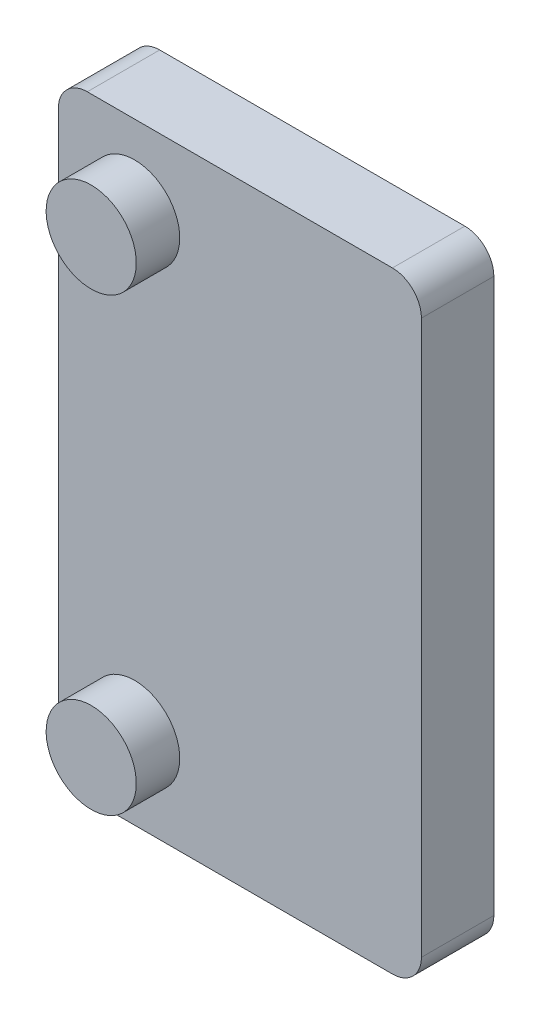
ISO-10303-21;
HEADER;
FILE_DESCRIPTION(('STEP AP214'),'2;1');
FILE_NAME('part.step','',(''),(''),'','','');
FILE_SCHEMA(('AUTOMOTIVE_DESIGN { 1 0 10303 214 1 1 1 1 }'));
ENDSEC;
DATA;
#1=APPLICATION_CONTEXT('core data for automotive mechanical design processes');
#2=APPLICATION_PROTOCOL_DEFINITION('international standard','automotive_design',2000,#1);
#3=PRODUCT_CONTEXT('',#1,'mechanical');
#4=PRODUCT('Part','Part','',(#3));
#5=PRODUCT_RELATED_PRODUCT_CATEGORY('part','',(#4));
#6=PRODUCT_DEFINITION_FORMATION('','',#4);
#7=PRODUCT_DEFINITION_CONTEXT('part definition',#1,'design');
#8=PRODUCT_DEFINITION('design','',#6,#7);
#9=PRODUCT_DEFINITION_SHAPE('','',#8);
#10=(LENGTH_UNIT() NAMED_UNIT(*) SI_UNIT(.MILLI.,.METRE.));
#11=(NAMED_UNIT(*) PLANE_ANGLE_UNIT() SI_UNIT($,.RADIAN.));
#12=(NAMED_UNIT(*) SI_UNIT($,.STERADIAN.) SOLID_ANGLE_UNIT());
#13=UNCERTAINTY_MEASURE_WITH_UNIT(LENGTH_MEASURE(1.E-05),#10,'distance_accuracy_value','');
#14=(GEOMETRIC_REPRESENTATION_CONTEXT(3) GLOBAL_UNCERTAINTY_ASSIGNED_CONTEXT((#13)) GLOBAL_UNIT_ASSIGNED_CONTEXT((#10,
#11,#12)) REPRESENTATION_CONTEXT('',''));
#15=CARTESIAN_POINT('',(0.,0.,0.));
#16=DIRECTION('',(0.,0.,1.));
#17=DIRECTION('',(1.,0.,0.));
#18=AXIS2_PLACEMENT_3D('',#15,#16,#17);
#19=CARTESIAN_POINT('',(6.874,10.5537,0.));
#20=DIRECTION('',(0.,0.,-1.));
#21=DIRECTION('',(-1.,0.,0.));
#22=AXIS2_PLACEMENT_3D('',#19,#20,#21);
#23=PLANE('',#22);
#24=CARTESIAN_POINT('',(10.5332083793333,20.1074,0.));
#25=DIRECTION('',(0.,0.,1.));
#26=DIRECTION('',(0.707106781186548,0.707106781186547,0.));
#27=AXIS2_PLACEMENT_3D('',#24,#25,#26);
#28=CIRCLE('',#27,1.);
#29=CARTESIAN_POINT('',(11.5332083793333,20.1074,0.));
#30=VERTEX_POINT('',#29);
#31=CARTESIAN_POINT('',(10.5332083793333,21.1074,0.));
#32=VERTEX_POINT('',#31);
#33=EDGE_CURVE('P0_E190',#30,#32,#28,.T.);
#34=ORIENTED_EDGE('',*,*,#33,.F.);
#35=DIRECTION('',(0.,-1.,0.));
#36=VECTOR('',#35,1.);
#37=CARTESIAN_POINT('',(11.5332083793333,0.,0.));
#38=LINE('',#37,#36);
#39=CARTESIAN_POINT('',(11.5332083793333,1.,0.));
#40=VERTEX_POINT('',#39);
#41=EDGE_CURVE('P0_E11',#30,#40,#38,.T.);
#42=ORIENTED_EDGE('',*,*,#41,.T.);
#43=CARTESIAN_POINT('',(10.5332083793333,1.,0.));
#44=DIRECTION('',(0.,0.,1.));
#45=DIRECTION('',(0.707106781186547,-0.707106781186548,0.));
#46=AXIS2_PLACEMENT_3D('',#43,#44,#45);
#47=CIRCLE('',#46,1.);
#48=CARTESIAN_POINT('',(10.5332083793333,0.,0.));
#49=VERTEX_POINT('',#48);
#50=EDGE_CURVE('P0_E93',#49,#40,#47,.T.);
#51=ORIENTED_EDGE('',*,*,#50,.F.);
#52=DIRECTION('',(-1.,0.,0.));
#53=VECTOR('',#52,1.);
#54=CARTESIAN_POINT('',(-1.,0.,0.));
#55=LINE('',#54,#53);
#56=CARTESIAN_POINT('',(0.,0.,0.));
#57=VERTEX_POINT('',#56);
#58=EDGE_CURVE('P0_E79',#49,#57,#55,.T.);
#59=ORIENTED_EDGE('',*,*,#58,.T.);
#60=CARTESIAN_POINT('',(0.,1.,0.));
#61=DIRECTION('',(0.,0.,1.));
#62=DIRECTION('',(-0.707106781186546,-0.707106781186549,0.));
#63=AXIS2_PLACEMENT_3D('',#60,#61,#62);
#64=CIRCLE('',#63,1.);
#65=CARTESIAN_POINT('',(-1.,1.,0.));
#66=VERTEX_POINT('',#65);
#67=EDGE_CURVE('P0_E50',#66,#57,#64,.T.);
#68=ORIENTED_EDGE('',*,*,#67,.F.);
#69=DIRECTION('',(0.,1.,0.));
#70=VECTOR('',#69,1.);
#71=CARTESIAN_POINT('',(-1.,21.1074,0.));
#72=LINE('',#71,#70);
#73=CARTESIAN_POINT('',(-1.,20.1074,0.));
#74=VERTEX_POINT('',#73);
#75=EDGE_CURVE('P0_E26',#66,#74,#72,.T.);
#76=ORIENTED_EDGE('',*,*,#75,.T.);
#77=CARTESIAN_POINT('',(0.,20.1074,0.));
#78=DIRECTION('',(0.,0.,1.));
#79=DIRECTION('',(-0.707106781186546,0.707106781186549,0.));
#80=AXIS2_PLACEMENT_3D('',#77,#78,#79);
#81=CIRCLE('',#80,1.);
#82=CARTESIAN_POINT('',(0.,21.1074,0.));
#83=VERTEX_POINT('',#82);
#84=EDGE_CURVE('P0_E113',#83,#74,#81,.T.);
#85=ORIENTED_EDGE('',*,*,#84,.F.);
#86=DIRECTION('',(1.,0.,0.));
#87=VECTOR('',#86,1.);
#88=CARTESIAN_POINT('',(11.5332083793333,21.1074,0.));
#89=LINE('',#88,#87);
#90=EDGE_CURVE('P0_E152',#83,#32,#89,.T.);
#91=ORIENTED_EDGE('',*,*,#90,.T.);
#92=EDGE_LOOP('',(#34,#42,#51,#59,#68,#76,#85,#91));
#93=FACE_BOUND('',#92,.T.);
#94=ADVANCED_FACE('P0_F17',(#93),#23,.T.);
#95=CARTESIAN_POINT('',(11.5332083793333,21.1074,2.5));
#96=DIRECTION('',(1.,0.,0.));
#97=DIRECTION('',(0.,-1.,0.));
#98=AXIS2_PLACEMENT_3D('',#95,#96,#97);
#99=PLANE('',#98);
#100=DIRECTION('',(0.,0.,-1.));
#101=VECTOR('',#100,1.);
#102=CARTESIAN_POINT('',(11.5332083793333,20.1074,2.5));
#103=LINE('',#102,#101);
#104=CARTESIAN_POINT('',(11.5332083793333,20.1074,2.5));
#105=VERTEX_POINT('',#104);
#106=EDGE_CURVE('P0_E119',#105,#30,#103,.T.);
#107=ORIENTED_EDGE('',*,*,#106,.F.);
#108=DIRECTION('',(0.,1.,0.));
#109=VECTOR('',#108,1.);
#110=CARTESIAN_POINT('',(11.5332083793333,0.,2.5));
#111=LINE('',#110,#109);
#112=CARTESIAN_POINT('',(11.5332083793333,1.,2.5));
#113=VERTEX_POINT('',#112);
#114=EDGE_CURVE('P0_E148',#113,#105,#111,.T.);
#115=ORIENTED_EDGE('',*,*,#114,.F.);
#116=DIRECTION('',(0.,0.,1.));
#117=VECTOR('',#116,1.);
#118=CARTESIAN_POINT('',(11.5332083793333,1.,2.5));
#119=LINE('',#118,#117);
#120=EDGE_CURVE('P0_E98',#40,#113,#119,.T.);
#121=ORIENTED_EDGE('',*,*,#120,.F.);
#122=ORIENTED_EDGE('',*,*,#41,.F.);
#123=EDGE_LOOP('',(#107,#115,#121,#122));
#124=FACE_BOUND('',#123,.T.);
#125=ADVANCED_FACE('P0_F217',(#124),#99,.T.);
#126=CARTESIAN_POINT('',(-1.,0.,2.5));
#127=DIRECTION('',(-1.,0.,0.));
#128=DIRECTION('',(0.,0.,1.));
#129=AXIS2_PLACEMENT_3D('',#126,#127,#128);
#130=PLANE('',#129);
#131=DIRECTION('',(0.,0.,1.));
#132=VECTOR('',#131,1.);
#133=CARTESIAN_POINT('',(-1.,20.1074,2.5));
#134=LINE('',#133,#132);
#135=CARTESIAN_POINT('',(-1.,20.1074,2.5));
#136=VERTEX_POINT('',#135);
#137=EDGE_CURVE('P0_E104',#74,#136,#134,.T.);
#138=ORIENTED_EDGE('',*,*,#137,.F.);
#139=ORIENTED_EDGE('',*,*,#75,.F.);
#140=DIRECTION('',(0.,0.,-1.));
#141=VECTOR('',#140,1.);
#142=CARTESIAN_POINT('',(-1.,1.,2.5));
#143=LINE('',#142,#141);
#144=CARTESIAN_POINT('',(-1.,1.,2.5));
#145=VERTEX_POINT('',#144);
#146=EDGE_CURVE('P0_E20',#145,#66,#143,.T.);
#147=ORIENTED_EDGE('',*,*,#146,.F.);
#148=DIRECTION('',(0.,-1.,0.));
#149=VECTOR('',#148,1.);
#150=CARTESIAN_POINT('',(-1.,21.1074,2.5));
#151=LINE('',#150,#149);
#152=EDGE_CURVE('P0_E130',#136,#145,#151,.T.);
#153=ORIENTED_EDGE('',*,*,#152,.F.);
#154=EDGE_LOOP('',(#138,#139,#147,#153));
#155=FACE_BOUND('',#154,.T.);
#156=ADVANCED_FACE('P0_F172',(#155),#130,.T.);
#157=CARTESIAN_POINT('',(0.,1.,2.5));
#158=DIRECTION('',(0.,0.,-1.));
#159=DIRECTION('',(-0.707106781186546,-0.707106781186549,0.));
#160=AXIS2_PLACEMENT_3D('',#157,#158,#159);
#161=CYLINDRICAL_SURFACE('',#160,1.);
#162=ORIENTED_EDGE('',*,*,#67,.T.);
#163=DIRECTION('',(0.,0.,1.));
#164=VECTOR('',#163,1.);
#165=CARTESIAN_POINT('',(0.,0.,2.5));
#166=LINE('',#165,#164);
#167=CARTESIAN_POINT('',(0.,0.,2.5));
#168=VERTEX_POINT('',#167);
#169=EDGE_CURVE('P0_E85',#57,#168,#166,.T.);
#170=ORIENTED_EDGE('',*,*,#169,.T.);
#171=CARTESIAN_POINT('',(0.,1.,2.5));
#172=DIRECTION('',(0.,0.,-1.));
#173=DIRECTION('',(-0.707106781186546,-0.707106781186549,0.));
#174=AXIS2_PLACEMENT_3D('',#171,#172,#173);
#175=CIRCLE('',#174,1.);
#176=EDGE_CURVE('P0_E135',#168,#145,#175,.T.);
#177=ORIENTED_EDGE('',*,*,#176,.T.);
#178=ORIENTED_EDGE('',*,*,#146,.T.);
#179=EDGE_LOOP('',(#162,#170,#177,#178));
#180=FACE_BOUND('',#179,.T.);
#181=ADVANCED_FACE('P0_F168',(#180),#161,.T.);
#182=CARTESIAN_POINT('',(11.5332083793333,0.,2.5));
#183=DIRECTION('',(0.,-1.,0.));
#184=DIRECTION('',(0.,0.,-1.));
#185=AXIS2_PLACEMENT_3D('',#182,#183,#184);
#186=PLANE('',#185);
#187=DIRECTION('',(0.,0.,-1.));
#188=VECTOR('',#187,1.);
#189=CARTESIAN_POINT('',(10.5332083793333,0.,2.5));
#190=LINE('',#189,#188);
#191=CARTESIAN_POINT('',(10.5332083793333,0.,2.5));
#192=VERTEX_POINT('',#191);
#193=EDGE_CURVE('P0_E83',#192,#49,#190,.T.);
#194=ORIENTED_EDGE('',*,*,#193,.F.);
#195=DIRECTION('',(1.,0.,0.));
#196=VECTOR('',#195,1.);
#197=CARTESIAN_POINT('',(-1.,0.,2.5));
#198=LINE('',#197,#196);
#199=EDGE_CURVE('P0_E139',#168,#192,#198,.T.);
#200=ORIENTED_EDGE('',*,*,#199,.F.);
#201=ORIENTED_EDGE('',*,*,#169,.F.);
#202=ORIENTED_EDGE('',*,*,#58,.F.);
#203=EDGE_LOOP('',(#194,#200,#201,#202));
#204=FACE_BOUND('',#203,.T.);
#205=ADVANCED_FACE('P0_F81',(#204),#186,.T.);
#206=CARTESIAN_POINT('',(10.5332083793333,1.,2.5));
#207=DIRECTION('',(0.,0.,-1.));
#208=DIRECTION('',(0.707106781186547,-0.707106781186548,0.));
#209=AXIS2_PLACEMENT_3D('',#206,#207,#208);
#210=CYLINDRICAL_SURFACE('',#209,1.);
#211=ORIENTED_EDGE('',*,*,#50,.T.);
#212=ORIENTED_EDGE('',*,*,#120,.T.);
#213=CARTESIAN_POINT('',(10.5332083793333,1.,2.5));
#214=DIRECTION('',(0.,0.,-1.));
#215=DIRECTION('',(0.707106781186547,-0.707106781186548,0.));
#216=AXIS2_PLACEMENT_3D('',#213,#214,#215);
#217=CIRCLE('',#216,1.);
#218=EDGE_CURVE('P0_E95',#113,#192,#217,.T.);
#219=ORIENTED_EDGE('',*,*,#218,.T.);
#220=ORIENTED_EDGE('',*,*,#193,.T.);
#221=EDGE_LOOP('',(#211,#212,#219,#220));
#222=FACE_BOUND('',#221,.T.);
#223=ADVANCED_FACE('P0_F92',(#222),#210,.T.);
#224=CARTESIAN_POINT('',(0.,20.1074,2.5));
#225=DIRECTION('',(0.,0.,-1.));
#226=DIRECTION('',(-0.707106781186546,0.707106781186549,0.));
#227=AXIS2_PLACEMENT_3D('',#224,#225,#226);
#228=CYLINDRICAL_SURFACE('',#227,1.);
#229=ORIENTED_EDGE('',*,*,#84,.T.);
#230=ORIENTED_EDGE('',*,*,#137,.T.);
#231=CARTESIAN_POINT('',(0.,20.1074,2.5));
#232=DIRECTION('',(0.,0.,-1.));
#233=DIRECTION('',(-0.707106781186546,0.707106781186549,0.));
#234=AXIS2_PLACEMENT_3D('',#231,#232,#233);
#235=CIRCLE('',#234,1.);
#236=CARTESIAN_POINT('',(0.,21.1074,2.5));
#237=VERTEX_POINT('',#236);
#238=EDGE_CURVE('P0_E127',#136,#237,#235,.T.);
#239=ORIENTED_EDGE('',*,*,#238,.T.);
#240=DIRECTION('',(0.,0.,-1.));
#241=VECTOR('',#240,1.);
#242=CARTESIAN_POINT('',(0.,21.1074,2.5));
#243=LINE('',#242,#241);
#244=EDGE_CURVE('P0_E143',#237,#83,#243,.T.);
#245=ORIENTED_EDGE('',*,*,#244,.T.);
#246=EDGE_LOOP('',(#229,#230,#239,#245));
#247=FACE_BOUND('',#246,.T.);
#248=ADVANCED_FACE('P0_F175',(#247),#228,.T.);
#249=CARTESIAN_POINT('',(-1.,21.1074,2.5));
#250=DIRECTION('',(0.,1.,0.));
#251=DIRECTION('',(1.,0.,0.));
#252=AXIS2_PLACEMENT_3D('',#249,#250,#251);
#253=PLANE('',#252);
#254=DIRECTION('',(0.,0.,1.));
#255=VECTOR('',#254,1.);
#256=CARTESIAN_POINT('',(10.5332083793333,21.1074,2.5));
#257=LINE('',#256,#255);
#258=CARTESIAN_POINT('',(10.5332083793333,21.1074,2.5));
#259=VERTEX_POINT('',#258);
#260=EDGE_CURVE('P0_E187',#32,#259,#257,.T.);
#261=ORIENTED_EDGE('',*,*,#260,.F.);
#262=ORIENTED_EDGE('',*,*,#90,.F.);
#263=ORIENTED_EDGE('',*,*,#244,.F.);
#264=DIRECTION('',(-1.,0.,0.));
#265=VECTOR('',#264,1.);
#266=CARTESIAN_POINT('',(11.5332083793333,21.1074,2.5));
#267=LINE('',#266,#265);
#268=EDGE_CURVE('P0_E123',#259,#237,#267,.T.);
#269=ORIENTED_EDGE('',*,*,#268,.F.);
#270=EDGE_LOOP('',(#261,#262,#263,#269));
#271=FACE_BOUND('',#270,.T.);
#272=ADVANCED_FACE('P0_F184',(#271),#253,.T.);
#273=CARTESIAN_POINT('',(6.874,10.5537,2.5));
#274=DIRECTION('',(0.,0.,-1.));
#275=DIRECTION('',(-1.,0.,0.));
#276=AXIS2_PLACEMENT_3D('',#273,#274,#275);
#277=PLANE('',#276);
#278=CARTESIAN_POINT('',(10.5332083793333,20.1074,2.5));
#279=DIRECTION('',(0.,0.,-1.));
#280=DIRECTION('',(0.707106781186548,0.707106781186547,0.));
#281=AXIS2_PLACEMENT_3D('',#278,#279,#280);
#282=CIRCLE('',#281,1.);
#283=EDGE_CURVE('P0_E116',#259,#105,#282,.T.);
#284=ORIENTED_EDGE('',*,*,#283,.F.);
#285=ORIENTED_EDGE('',*,*,#268,.T.);
#286=ORIENTED_EDGE('',*,*,#238,.F.);
#287=ORIENTED_EDGE('',*,*,#152,.T.);
#288=ORIENTED_EDGE('',*,*,#176,.F.);
#289=ORIENTED_EDGE('',*,*,#199,.T.);
#290=ORIENTED_EDGE('',*,*,#218,.F.);
#291=ORIENTED_EDGE('',*,*,#114,.T.);
#292=EDGE_LOOP('',(#284,#285,#286,#287,#288,#289,#290,#291));
#293=FACE_BOUND('',#292,.T.);
#294=ADVANCED_FACE('P0_F214',(#293),#277,.F.);
#295=CARTESIAN_POINT('',(10.5332083793333,20.1074,2.5));
#296=DIRECTION('',(0.,0.,-1.));
#297=DIRECTION('',(0.707106781186548,0.707106781186547,0.));
#298=AXIS2_PLACEMENT_3D('',#295,#296,#297);
#299=CYLINDRICAL_SURFACE('',#298,1.);
#300=ORIENTED_EDGE('',*,*,#33,.T.);
#301=ORIENTED_EDGE('',*,*,#260,.T.);
#302=ORIENTED_EDGE('',*,*,#283,.T.);
#303=ORIENTED_EDGE('',*,*,#106,.T.);
#304=EDGE_LOOP('',(#300,#301,#302,#303));
#305=FACE_BOUND('',#304,.T.);
#306=ADVANCED_FACE('P0_F219',(#305),#299,.T.);
#307=CLOSED_SHELL('',(#94,#125,#156,#181,#205,#223,#248,#272,#294,#306));
#308=MANIFOLD_SOLID_BREP('P0_B1',#307);
#309=CARTESIAN_POINT('',(6.874,10.5537,4.));
#310=DIRECTION('',(0.,0.,-1.));
#311=DIRECTION('',(-1.,0.,0.));
#312=AXIS2_PLACEMENT_3D('',#309,#310,#311);
#313=PLANE('',#312);
#314=CARTESIAN_POINT('',(1.63525,18.33245,4.));
#315=DIRECTION('',(0.,0.,1.));
#316=DIRECTION('',(0.,-1.,0.));
#317=AXIS2_PLACEMENT_3D('',#314,#315,#316);
#318=CIRCLE('',#317,1.55575);
#319=CARTESIAN_POINT('',(1.63525,19.8882,4.));
#320=VERTEX_POINT('',#319);
#321=EDGE_CURVE('P1_E43',#320,#320,#318,.T.);
#322=ORIENTED_EDGE('',*,*,#321,.T.);
#323=EDGE_LOOP('',(#322));
#324=FACE_BOUND('',#323,.T.);
#325=ADVANCED_FACE('P1_F17',(#324),#313,.F.);
#326=CARTESIAN_POINT('',(6.874,10.5537,2.5));
#327=DIRECTION('',(0.,0.,-1.));
#328=DIRECTION('',(-1.,0.,0.));
#329=AXIS2_PLACEMENT_3D('',#326,#327,#328);
#330=PLANE('',#329);
#331=CARTESIAN_POINT('',(1.63525,18.33245,2.5));
#332=DIRECTION('',(0.,0.,-1.));
#333=DIRECTION('',(0.,-1.,0.));
#334=AXIS2_PLACEMENT_3D('',#331,#332,#333);
#335=CIRCLE('',#334,1.55575);
#336=CARTESIAN_POINT('',(1.63525,19.8882,2.5));
#337=VERTEX_POINT('',#336);
#338=EDGE_CURVE('P1_E11',#337,#337,#335,.T.);
#339=ORIENTED_EDGE('',*,*,#338,.T.);
#340=EDGE_LOOP('',(#339));
#341=FACE_BOUND('',#340,.T.);
#342=ADVANCED_FACE('P1_F63',(#341),#330,.T.);
#343=CARTESIAN_POINT('',(1.63525,18.33245,2.5));
#344=DIRECTION('',(0.,0.,1.));
#345=DIRECTION('',(0.,-1.,0.));
#346=AXIS2_PLACEMENT_3D('',#343,#344,#345);
#347=CYLINDRICAL_SURFACE('',#346,1.55575);
#348=ORIENTED_EDGE('',*,*,#321,.F.);
#349=DIRECTION('',(0.,0.,-1.));
#350=VECTOR('',#349,1.);
#351=CARTESIAN_POINT('',(1.63525,19.8882,2.5));
#352=LINE('',#351,#350);
#353=EDGE_CURVE('P1_E20',#320,#337,#352,.T.);
#354=ORIENTED_EDGE('',*,*,#353,.T.);
#355=ORIENTED_EDGE('',*,*,#338,.F.);
#356=ORIENTED_EDGE('',*,*,#353,.F.);
#357=EDGE_LOOP('',(#348,#354,#355,#356));
#358=FACE_BOUND('',#357,.T.);
#359=ADVANCED_FACE('P1_F42',(#358),#347,.T.);
#360=CLOSED_SHELL('',(#325,#342,#359));
#361=MANIFOLD_SOLID_BREP('P1_B1',#360);
#362=CARTESIAN_POINT('',(6.874,10.5537,4.));
#363=DIRECTION('',(0.,0.,-1.));
#364=DIRECTION('',(-1.,0.,0.));
#365=AXIS2_PLACEMENT_3D('',#362,#363,#364);
#366=PLANE('',#365);
#367=CARTESIAN_POINT('',(1.63525,2.77495,4.));
#368=DIRECTION('',(0.,0.,1.));
#369=DIRECTION('',(0.,-1.,0.));
#370=AXIS2_PLACEMENT_3D('',#367,#368,#369);
#371=CIRCLE('',#370,1.55575);
#372=CARTESIAN_POINT('',(1.63525,4.3307,4.));
#373=VERTEX_POINT('',#372);
#374=EDGE_CURVE('P2_E42',#373,#373,#371,.T.);
#375=ORIENTED_EDGE('',*,*,#374,.T.);
#376=EDGE_LOOP('',(#375));
#377=FACE_BOUND('',#376,.T.);
#378=ADVANCED_FACE('P2_F16',(#377),#366,.F.);
#379=CARTESIAN_POINT('',(6.874,10.5537,2.5));
#380=DIRECTION('',(0.,0.,-1.));
#381=DIRECTION('',(-1.,0.,0.));
#382=AXIS2_PLACEMENT_3D('',#379,#380,#381);
#383=PLANE('',#382);
#384=CARTESIAN_POINT('',(1.63525,2.77495,2.5));
#385=DIRECTION('',(0.,0.,-1.));
#386=DIRECTION('',(0.,-1.,0.));
#387=AXIS2_PLACEMENT_3D('',#384,#385,#386);
#388=CIRCLE('',#387,1.55575);
#389=CARTESIAN_POINT('',(1.63525,4.3307,2.5));
#390=VERTEX_POINT('',#389);
#391=EDGE_CURVE('P2_E10',#390,#390,#388,.T.);
#392=ORIENTED_EDGE('',*,*,#391,.T.);
#393=EDGE_LOOP('',(#392));
#394=FACE_BOUND('',#393,.T.);
#395=ADVANCED_FACE('P2_F18',(#394),#383,.T.);
#396=CARTESIAN_POINT('',(1.63525,2.77495,2.5));
#397=DIRECTION('',(0.,0.,1.));
#398=DIRECTION('',(0.,-1.,0.));
#399=AXIS2_PLACEMENT_3D('',#396,#397,#398);
#400=CYLINDRICAL_SURFACE('',#399,1.55575);
#401=ORIENTED_EDGE('',*,*,#374,.F.);
#402=DIRECTION('',(0.,0.,-1.));
#403=VECTOR('',#402,1.);
#404=CARTESIAN_POINT('',(1.63525,4.3307,2.5));
#405=LINE('',#404,#403);
#406=EDGE_CURVE('P2_E25',#373,#390,#405,.T.);
#407=ORIENTED_EDGE('',*,*,#406,.T.);
#408=ORIENTED_EDGE('',*,*,#391,.F.);
#409=ORIENTED_EDGE('',*,*,#406,.F.);
#410=EDGE_LOOP('',(#401,#407,#408,#409));
#411=FACE_BOUND('',#410,.T.);
#412=ADVANCED_FACE('P2_F41',(#411),#400,.T.);
#413=CLOSED_SHELL('',(#378,#395,#412));
#414=MANIFOLD_SOLID_BREP('P2_B1',#413);
#415=ADVANCED_BREP_SHAPE_REPRESENTATION('',(#18,#308,#361,#414),#14);
#416=SHAPE_DEFINITION_REPRESENTATION(#9,#415);
ENDSEC;
END-ISO-10303-21;
